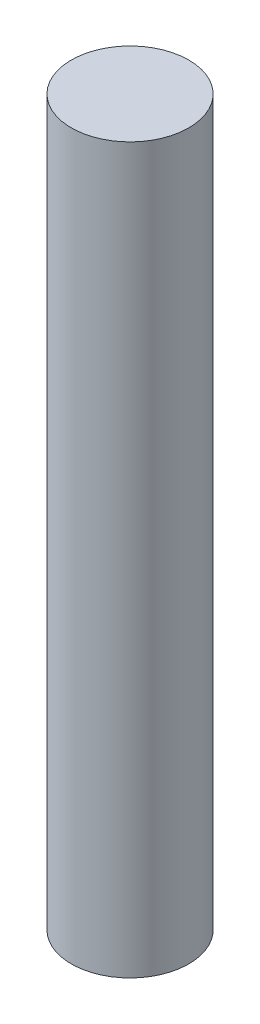
ISO-10303-21;
HEADER;
FILE_DESCRIPTION(('STEP AP214'),'2;1');
FILE_NAME('part.step','',(''),(''),'','','');
FILE_SCHEMA(('AUTOMOTIVE_DESIGN { 1 0 10303 214 1 1 1 1 }'));
ENDSEC;
DATA;
#1=APPLICATION_CONTEXT('core data for automotive mechanical design processes');
#2=APPLICATION_PROTOCOL_DEFINITION('international standard','automotive_design',2000,#1);
#3=PRODUCT_CONTEXT('',#1,'mechanical');
#4=PRODUCT('Part','Part','',(#3));
#5=PRODUCT_RELATED_PRODUCT_CATEGORY('part','',(#4));
#6=PRODUCT_DEFINITION_FORMATION('','',#4);
#7=PRODUCT_DEFINITION_CONTEXT('part definition',#1,'design');
#8=PRODUCT_DEFINITION('design','',#6,#7);
#9=PRODUCT_DEFINITION_SHAPE('','',#8);
#10=(LENGTH_UNIT() NAMED_UNIT(*) SI_UNIT(.MILLI.,.METRE.));
#11=(NAMED_UNIT(*) PLANE_ANGLE_UNIT() SI_UNIT($,.RADIAN.));
#12=(NAMED_UNIT(*) SI_UNIT($,.STERADIAN.) SOLID_ANGLE_UNIT());
#13=UNCERTAINTY_MEASURE_WITH_UNIT(LENGTH_MEASURE(1.E-05),#10,'distance_accuracy_value','');
#14=(GEOMETRIC_REPRESENTATION_CONTEXT(3) GLOBAL_UNCERTAINTY_ASSIGNED_CONTEXT((#13)) GLOBAL_UNIT_ASSIGNED_CONTEXT((#10,
#11,#12)) REPRESENTATION_CONTEXT('',''));
#15=CARTESIAN_POINT('',(0.,0.,0.));
#16=DIRECTION('',(0.,0.,1.));
#17=DIRECTION('',(1.,0.,0.));
#18=AXIS2_PLACEMENT_3D('',#15,#16,#17);
#19=CARTESIAN_POINT('',(0.,58.68,0.));
#20=DIRECTION('',(0.,-1.,0.));
#21=DIRECTION('',(0.,0.,-1.));
#22=AXIS2_PLACEMENT_3D('',#19,#20,#21);
#23=CYLINDRICAL_SURFACE('',#22,4.7625);
#24=CARTESIAN_POINT('',(0.,58.68,0.));
#25=DIRECTION('',(0.,1.,0.));
#26=DIRECTION('',(0.,0.,1.));
#27=AXIS2_PLACEMENT_3D('',#24,#25,#26);
#28=CIRCLE('',#27,4.7625);
#29=CARTESIAN_POINT('',(0.,58.68,-4.7625));
#30=VERTEX_POINT('',#29);
#31=EDGE_CURVE('E10',#30,#30,#28,.T.);
#32=CARTESIAN_POINT('',(0.,0.,0.));
#33=DIRECTION('',(0.,1.,0.));
#34=DIRECTION('',(0.,0.,1.));
#35=AXIS2_PLACEMENT_3D('',#32,#33,#34);
#36=CIRCLE('',#35,4.7625);
#37=CARTESIAN_POINT('',(0.,0.,-4.7625));
#38=VERTEX_POINT('',#37);
#39=EDGE_CURVE('E42',#38,#38,#36,.T.);
#40=CARTESIAN_POINT('',(0.,58.68,-4.7625));
#41=CARTESIAN_POINT('',(0.,58.06875,-4.7625));
#42=CARTESIAN_POINT('',(0.,57.4575,-4.7625));
#43=CARTESIAN_POINT('',(0.,56.235,-4.7625));
#44=CARTESIAN_POINT('',(0.,55.62375,-4.7625));
#45=CARTESIAN_POINT('',(0.,54.40125,-4.7625));
#46=CARTESIAN_POINT('',(0.,53.79,-4.7625));
#47=CARTESIAN_POINT('',(0.,52.5675,-4.7625));
#48=CARTESIAN_POINT('',(0.,51.95625,-4.7625));
#49=CARTESIAN_POINT('',(0.,50.73375,-4.7625));
#50=CARTESIAN_POINT('',(0.,50.1225,-4.7625));
#51=CARTESIAN_POINT('',(0.,48.9,-4.7625));
#52=CARTESIAN_POINT('',(0.,48.28875,-4.7625));
#53=CARTESIAN_POINT('',(0.,47.06625,-4.7625));
#54=CARTESIAN_POINT('',(0.,46.455,-4.7625));
#55=CARTESIAN_POINT('',(0.,45.2325,-4.7625));
#56=CARTESIAN_POINT('',(0.,44.62125,-4.7625));
#57=CARTESIAN_POINT('',(0.,43.39875,-4.7625));
#58=CARTESIAN_POINT('',(0.,42.7875,-4.7625));
#59=CARTESIAN_POINT('',(0.,41.565,-4.7625));
#60=CARTESIAN_POINT('',(0.,40.95375,-4.7625));
#61=CARTESIAN_POINT('',(0.,39.73125,-4.7625));
#62=CARTESIAN_POINT('',(0.,39.12,-4.7625));
#63=CARTESIAN_POINT('',(0.,37.8975,-4.7625));
#64=CARTESIAN_POINT('',(0.,37.28625,-4.7625));
#65=CARTESIAN_POINT('',(0.,36.06375,-4.7625));
#66=CARTESIAN_POINT('',(0.,35.4525,-4.7625));
#67=CARTESIAN_POINT('',(0.,34.23,-4.7625));
#68=CARTESIAN_POINT('',(0.,33.61875,-4.7625));
#69=CARTESIAN_POINT('',(0.,32.39625,-4.7625));
#70=CARTESIAN_POINT('',(0.,31.785,-4.7625));
#71=CARTESIAN_POINT('',(0.,30.5625,-4.7625));
#72=CARTESIAN_POINT('',(0.,29.95125,-4.7625));
#73=CARTESIAN_POINT('',(0.,28.72875,-4.7625));
#74=CARTESIAN_POINT('',(0.,28.1175,-4.7625));
#75=CARTESIAN_POINT('',(0.,26.895,-4.7625));
#76=CARTESIAN_POINT('',(0.,26.28375,-4.7625));
#77=CARTESIAN_POINT('',(0.,25.06125,-4.7625));
#78=CARTESIAN_POINT('',(0.,24.45,-4.7625));
#79=CARTESIAN_POINT('',(0.,23.2275,-4.7625));
#80=CARTESIAN_POINT('',(0.,22.61625,-4.7625));
#81=CARTESIAN_POINT('',(0.,21.39375,-4.7625));
#82=CARTESIAN_POINT('',(0.,20.7825,-4.7625));
#83=CARTESIAN_POINT('',(0.,19.56,-4.7625));
#84=CARTESIAN_POINT('',(0.,18.94875,-4.7625));
#85=CARTESIAN_POINT('',(0.,17.72625,-4.7625));
#86=CARTESIAN_POINT('',(0.,17.115,-4.7625));
#87=CARTESIAN_POINT('',(0.,15.8925,-4.7625));
#88=CARTESIAN_POINT('',(0.,15.28125,-4.7625));
#89=CARTESIAN_POINT('',(0.,14.05875,-4.7625));
#90=CARTESIAN_POINT('',(0.,13.4475,-4.7625));
#91=CARTESIAN_POINT('',(0.,12.225,-4.7625));
#92=CARTESIAN_POINT('',(0.,11.61375,-4.7625));
#93=CARTESIAN_POINT('',(0.,10.39125,-4.7625));
#94=CARTESIAN_POINT('',(0.,9.78,-4.7625));
#95=CARTESIAN_POINT('',(0.,8.5575,-4.7625));
#96=CARTESIAN_POINT('',(0.,7.94625,-4.7625));
#97=CARTESIAN_POINT('',(0.,6.72375,-4.7625));
#98=CARTESIAN_POINT('',(0.,6.1125,-4.7625));
#99=CARTESIAN_POINT('',(0.,4.89,-4.7625));
#100=CARTESIAN_POINT('',(0.,4.27875,-4.7625));
#101=CARTESIAN_POINT('',(0.,3.05625,-4.7625));
#102=CARTESIAN_POINT('',(0.,2.445,-4.7625));
#103=CARTESIAN_POINT('',(0.,1.2225,-4.7625));
#104=CARTESIAN_POINT('',(0.,0.61125,-4.7625));
#105=CARTESIAN_POINT('',(0.,0.,-4.7625));
#106=B_SPLINE_CURVE_WITH_KNOTS('',3,(#40,#41,#42,#43,#44,#45,#46,#47,#48,#49,#50,#51,#52,#53,
#54,#55,#56,#57,#58,#59,#60,#61,#62,#63,#64,#65,#66,#67,#68,#69,#70,#71,#72,#73,#74,#75,#76,#77,
#78,#79,#80,#81,#82,#83,#84,#85,#86,#87,#88,#89,#90,#91,#92,#93,#94,#95,#96,#97,#98,#99,#100,
#101,#102,#103,#104,#105),.UNSPECIFIED.,.F.,.F.,(4,2,2,2,2,2,2,2,2,2,2,2,2,2,2,2,2,2,2,2,2,2,2,
2,2,2,2,2,2,2,2,2,4),(0.,1.83375,3.6675,5.50125,7.33499999999999,9.16875,11.0025,12.83625,14.67,
16.50375,18.3375,20.17125,22.005,23.83875,25.6725,27.50625,29.34,31.17375,33.0075,34.84125,
36.675,38.50875,40.3425,42.17625,44.01,45.84375,47.6775,49.51125,51.345,53.17875,55.0125,
56.84625,58.68),.UNSPECIFIED.);
#107=EDGE_CURVE('BSEAM39',#30,#38,#106,.T.);
#108=ORIENTED_EDGE('',*,*,#31,.F.);
#109=ORIENTED_EDGE('',*,*,#39,.T.);
#110=ORIENTED_EDGE('',*,*,#107,.T.);
#111=ORIENTED_EDGE('',*,*,#107,.F.);
#112=EDGE_LOOP('',(#108,#110,#109,#111));
#113=FACE_BOUND('',#112,.T.);
#114=ADVANCED_FACE('F39',(#113),#23,.T.);
#115=CARTESIAN_POINT('',(0.,58.68,0.));
#116=DIRECTION('',(0.,1.,0.));
#117=DIRECTION('',(0.,0.,1.));
#118=AXIS2_PLACEMENT_3D('',#115,#116,#117);
#119=PLANE('',#118);
#120=ORIENTED_EDGE('',*,*,#31,.T.);
#121=EDGE_LOOP('',(#120));
#122=FACE_BOUND('',#121,.T.);
#123=ADVANCED_FACE('F54',(#122),#119,.T.);
#124=CARTESIAN_POINT('',(0.,0.,0.));
#125=DIRECTION('',(0.,1.,0.));
#126=DIRECTION('',(0.,0.,1.));
#127=AXIS2_PLACEMENT_3D('',#124,#125,#126);
#128=PLANE('',#127);
#129=ORIENTED_EDGE('',*,*,#39,.F.);
#130=EDGE_LOOP('',(#129));
#131=FACE_BOUND('',#130,.T.);
#132=ADVANCED_FACE('F52',(#131),#128,.F.);
#133=CLOSED_SHELL('',(#114,#123,#132));
#134=MANIFOLD_SOLID_BREP('B2',#133);
#135=ADVANCED_BREP_SHAPE_REPRESENTATION('',(#18,#134),#14);
#136=SHAPE_DEFINITION_REPRESENTATION(#9,#135);
ENDSEC;
END-ISO-10303-21;
